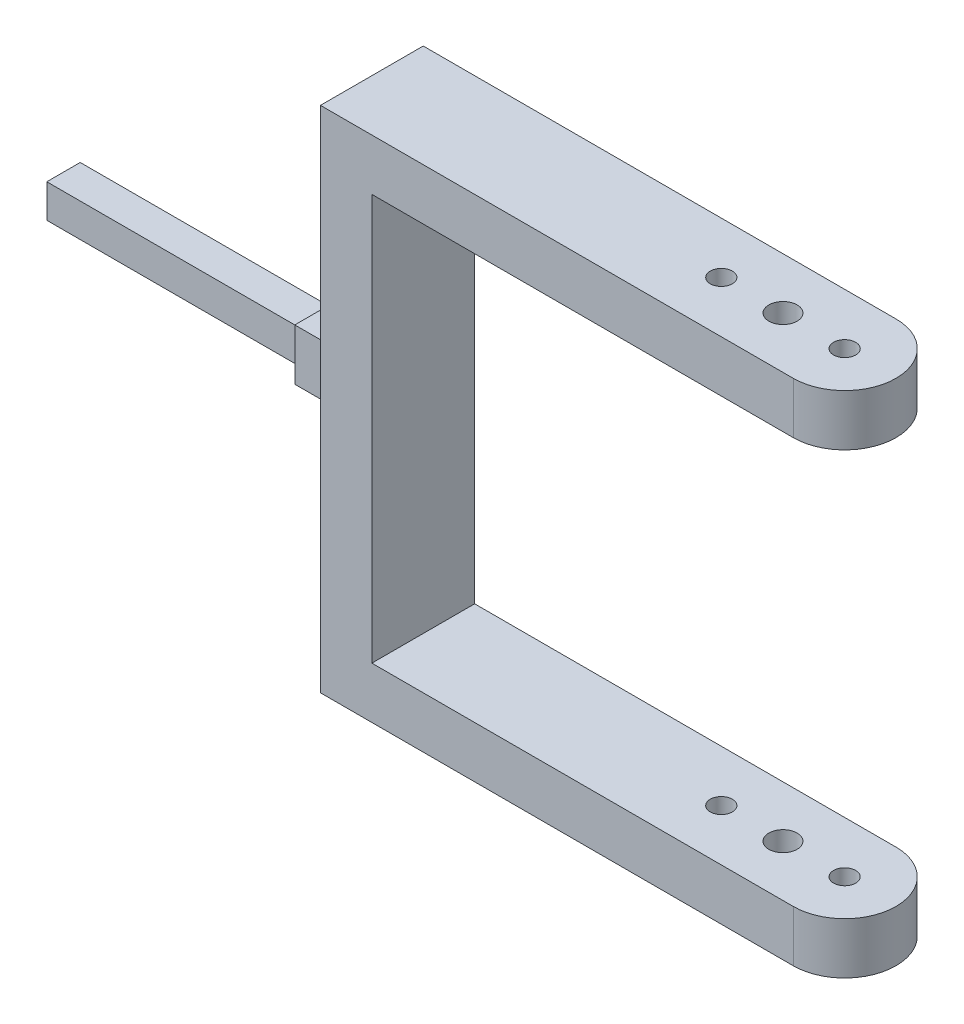
ISO-10303-21;
HEADER;
FILE_DESCRIPTION(('STEP AP214'),'2;1');
FILE_NAME('part.step','',(''),(''),'','','');
FILE_SCHEMA(('AUTOMOTIVE_DESIGN { 1 0 10303 214 1 1 1 1 }'));
ENDSEC;
DATA;
#1=APPLICATION_CONTEXT('core data for automotive mechanical design processes');
#2=APPLICATION_PROTOCOL_DEFINITION('international standard','automotive_design',2000,#1);
#3=PRODUCT_CONTEXT('',#1,'mechanical');
#4=PRODUCT('Part','Part','',(#3));
#5=PRODUCT_RELATED_PRODUCT_CATEGORY('part','',(#4));
#6=PRODUCT_DEFINITION_FORMATION('','',#4);
#7=PRODUCT_DEFINITION_CONTEXT('part definition',#1,'design');
#8=PRODUCT_DEFINITION('design','',#6,#7);
#9=PRODUCT_DEFINITION_SHAPE('','',#8);
#10=(LENGTH_UNIT() NAMED_UNIT(*) SI_UNIT(.MILLI.,.METRE.));
#11=(NAMED_UNIT(*) PLANE_ANGLE_UNIT() SI_UNIT($,.RADIAN.));
#12=(NAMED_UNIT(*) SI_UNIT($,.STERADIAN.) SOLID_ANGLE_UNIT());
#13=UNCERTAINTY_MEASURE_WITH_UNIT(LENGTH_MEASURE(1.E-05),#10,'distance_accuracy_value','');
#14=(GEOMETRIC_REPRESENTATION_CONTEXT(3) GLOBAL_UNCERTAINTY_ASSIGNED_CONTEXT((#13)) GLOBAL_UNIT_ASSIGNED_CONTEXT((#10,
#11,#12)) REPRESENTATION_CONTEXT('',''));
#15=CARTESIAN_POINT('',(0.,0.,0.));
#16=DIRECTION('',(0.,0.,1.));
#17=DIRECTION('',(1.,0.,0.));
#18=AXIS2_PLACEMENT_3D('',#15,#16,#17);
#19=CARTESIAN_POINT('',(80.,49.5,20.));
#20=DIRECTION('',(0.,-1.,0.));
#21=DIRECTION('',(1.,0.,0.));
#22=AXIS2_PLACEMENT_3D('',#19,#20,#21);
#23=PLANE('',#22);
#24=CARTESIAN_POINT('',(82.,49.5,10.));
#25=DIRECTION('',(0.,1.,0.));
#26=DIRECTION('',(-1.,0.,0.));
#27=AXIS2_PLACEMENT_3D('',#24,#25,#26);
#28=CIRCLE('',#27,2.15);
#29=CARTESIAN_POINT('',(79.85,49.5,10.));
#30=VERTEX_POINT('',#29);
#31=EDGE_CURVE('E325',#30,#30,#28,.T.);
#32=ORIENTED_EDGE('',*,*,#31,.F.);
#33=EDGE_LOOP('',(#32));
#34=FACE_BOUND('',#33,.T.);
#35=CARTESIAN_POINT('',(70.,49.5,10.));
#36=DIRECTION('',(0.,1.,0.));
#37=DIRECTION('',(-1.,0.,0.));
#38=AXIS2_PLACEMENT_3D('',#35,#36,#37);
#39=CIRCLE('',#38,2.74999999999999);
#40=CARTESIAN_POINT('',(67.25,49.5,10.));
#41=VERTEX_POINT('',#40);
#42=EDGE_CURVE('E336',#41,#41,#39,.T.);
#43=ORIENTED_EDGE('',*,*,#42,.F.);
#44=EDGE_LOOP('',(#43));
#45=FACE_BOUND('',#44,.T.);
#46=CARTESIAN_POINT('',(58.,49.5,10.));
#47=DIRECTION('',(0.,1.,0.));
#48=DIRECTION('',(-1.,0.,0.));
#49=AXIS2_PLACEMENT_3D('',#46,#47,#48);
#50=CIRCLE('',#49,2.15);
#51=CARTESIAN_POINT('',(55.85,49.5,10.));
#52=VERTEX_POINT('',#51);
#53=EDGE_CURVE('E335',#52,#52,#50,.T.);
#54=ORIENTED_EDGE('',*,*,#53,.F.);
#55=EDGE_LOOP('',(#54));
#56=FACE_BOUND('',#55,.T.);
#57=DIRECTION('',(-1.,0.,0.));
#58=VECTOR('',#57,1.);
#59=CARTESIAN_POINT('',(80.,49.5,20.));
#60=LINE('',#59,#58);
#61=CARTESIAN_POINT('',(82.,49.5,20.));
#62=VERTEX_POINT('',#61);
#63=CARTESIAN_POINT('',(-9.99999999999999,49.5,20.));
#64=VERTEX_POINT('',#63);
#65=EDGE_CURVE('E201',#62,#64,#60,.T.);
#66=ORIENTED_EDGE('',*,*,#65,.F.);
#67=CARTESIAN_POINT('',(82.,49.5,10.));
#68=DIRECTION('',(0.,1.,0.));
#69=DIRECTION('',(-1.,0.,0.));
#70=AXIS2_PLACEMENT_3D('',#67,#68,#69);
#71=CIRCLE('',#70,10.);
#72=CARTESIAN_POINT('',(82.,49.5,0.));
#73=VERTEX_POINT('',#72);
#74=EDGE_CURVE('E183',#62,#73,#71,.T.);
#75=ORIENTED_EDGE('',*,*,#74,.T.);
#76=DIRECTION('',(-1.,0.,0.));
#77=VECTOR('',#76,1.);
#78=CARTESIAN_POINT('',(80.,49.5,0.));
#79=LINE('',#78,#77);
#80=CARTESIAN_POINT('',(-9.99999999999999,49.5,0.));
#81=VERTEX_POINT('',#80);
#82=EDGE_CURVE('E210',#73,#81,#79,.T.);
#83=ORIENTED_EDGE('',*,*,#82,.T.);
#84=DIRECTION('',(0.,0.,-1.));
#85=VECTOR('',#84,1.);
#86=CARTESIAN_POINT('',(-9.99999999999999,49.5,20.));
#87=LINE('',#86,#85);
#88=EDGE_CURVE('E68',#64,#81,#87,.T.);
#89=ORIENTED_EDGE('',*,*,#88,.F.);
#90=EDGE_LOOP('',(#66,#75,#83,#89));
#91=FACE_BOUND('',#90,.T.);
#92=ADVANCED_FACE('F61',(#34,#45,#56,#91),#23,.F.);
#93=CARTESIAN_POINT('',(-9.99999999999999,-49.5,20.));
#94=DIRECTION('',(0.,1.,0.));
#95=DIRECTION('',(-1.,0.,0.));
#96=AXIS2_PLACEMENT_3D('',#93,#94,#95);
#97=PLANE('',#96);
#98=CARTESIAN_POINT('',(82.,-49.5,10.));
#99=DIRECTION('',(0.,1.,0.));
#100=DIRECTION('',(-1.,0.,0.));
#101=AXIS2_PLACEMENT_3D('',#98,#99,#100);
#102=CIRCLE('',#101,2.15);
#103=CARTESIAN_POINT('',(79.85,-49.5,10.));
#104=VERTEX_POINT('',#103);
#105=EDGE_CURVE('E328',#104,#104,#102,.T.);
#106=ORIENTED_EDGE('',*,*,#105,.T.);
#107=EDGE_LOOP('',(#106));
#108=FACE_BOUND('',#107,.T.);
#109=CARTESIAN_POINT('',(70.,-49.5,10.));
#110=DIRECTION('',(0.,1.,0.));
#111=DIRECTION('',(-1.,0.,0.));
#112=AXIS2_PLACEMENT_3D('',#109,#110,#111);
#113=CIRCLE('',#112,2.74999999999999);
#114=CARTESIAN_POINT('',(67.25,-49.5,10.));
#115=VERTEX_POINT('',#114);
#116=EDGE_CURVE('E332',#115,#115,#113,.T.);
#117=ORIENTED_EDGE('',*,*,#116,.T.);
#118=EDGE_LOOP('',(#117));
#119=FACE_BOUND('',#118,.T.);
#120=CARTESIAN_POINT('',(58.,-49.5,10.));
#121=DIRECTION('',(0.,1.,0.));
#122=DIRECTION('',(-1.,0.,0.));
#123=AXIS2_PLACEMENT_3D('',#120,#121,#122);
#124=CIRCLE('',#123,2.15);
#125=CARTESIAN_POINT('',(55.85,-49.5,10.));
#126=VERTEX_POINT('',#125);
#127=EDGE_CURVE('E342',#126,#126,#124,.T.);
#128=ORIENTED_EDGE('',*,*,#127,.T.);
#129=EDGE_LOOP('',(#128));
#130=FACE_BOUND('',#129,.T.);
#131=CARTESIAN_POINT('',(82.,-49.5,10.));
#132=DIRECTION('',(0.,1.,0.));
#133=DIRECTION('',(-1.,0.,0.));
#134=AXIS2_PLACEMENT_3D('',#131,#132,#133);
#135=CIRCLE('',#134,10.);
#136=CARTESIAN_POINT('',(82.,-49.5,20.));
#137=VERTEX_POINT('',#136);
#138=CARTESIAN_POINT('',(82.,-49.5,0.));
#139=VERTEX_POINT('',#138);
#140=EDGE_CURVE('E172',#137,#139,#135,.T.);
#141=ORIENTED_EDGE('',*,*,#140,.F.);
#142=DIRECTION('',(1.,0.,0.));
#143=VECTOR('',#142,1.);
#144=CARTESIAN_POINT('',(-9.99999999999999,-49.5,20.));
#145=LINE('',#144,#143);
#146=CARTESIAN_POINT('',(-9.99999999999999,-49.5,20.));
#147=VERTEX_POINT('',#146);
#148=EDGE_CURVE('E177',#147,#137,#145,.T.);
#149=ORIENTED_EDGE('',*,*,#148,.F.);
#150=DIRECTION('',(0.,0.,-1.));
#151=VECTOR('',#150,1.);
#152=CARTESIAN_POINT('',(-9.99999999999999,-49.5,20.));
#153=LINE('',#152,#151);
#154=CARTESIAN_POINT('',(-9.99999999999999,-49.5,0.));
#155=VERTEX_POINT('',#154);
#156=EDGE_CURVE('E228',#147,#155,#153,.T.);
#157=ORIENTED_EDGE('',*,*,#156,.T.);
#158=DIRECTION('',(1.,0.,0.));
#159=VECTOR('',#158,1.);
#160=CARTESIAN_POINT('',(-9.99999999999999,-49.5,0.));
#161=LINE('',#160,#159);
#162=EDGE_CURVE('E179',#155,#139,#161,.T.);
#163=ORIENTED_EDGE('',*,*,#162,.T.);
#164=EDGE_LOOP('',(#141,#149,#157,#163));
#165=FACE_BOUND('',#164,.T.);
#166=ADVANCED_FACE('F174',(#108,#119,#130,#165),#97,.F.);
#167=CARTESIAN_POINT('',(80.,-39.4999999999999,20.));
#168=DIRECTION('',(0.,-1.,0.));
#169=DIRECTION('',(1.,0.,0.));
#170=AXIS2_PLACEMENT_3D('',#167,#168,#169);
#171=PLANE('',#170);
#172=CARTESIAN_POINT('',(82.,-39.4999999999999,10.));
#173=DIRECTION('',(0.,-1.,0.));
#174=DIRECTION('',(1.,0.,0.));
#175=AXIS2_PLACEMENT_3D('',#172,#173,#174);
#176=CIRCLE('',#175,2.15);
#177=CARTESIAN_POINT('',(84.15,-39.4999999999999,10.));
#178=VERTEX_POINT('',#177);
#179=EDGE_CURVE('E238',#178,#178,#176,.T.);
#180=ORIENTED_EDGE('',*,*,#179,.T.);
#181=EDGE_LOOP('',(#180));
#182=FACE_BOUND('',#181,.T.);
#183=CARTESIAN_POINT('',(70.,-39.5,10.));
#184=DIRECTION('',(0.,-1.,0.));
#185=DIRECTION('',(1.,0.,0.));
#186=AXIS2_PLACEMENT_3D('',#183,#184,#185);
#187=CIRCLE('',#186,2.74999999999999);
#188=CARTESIAN_POINT('',(72.75,-39.5,10.));
#189=VERTEX_POINT('',#188);
#190=EDGE_CURVE('E235',#189,#189,#187,.T.);
#191=ORIENTED_EDGE('',*,*,#190,.T.);
#192=EDGE_LOOP('',(#191));
#193=FACE_BOUND('',#192,.T.);
#194=CARTESIAN_POINT('',(58.,-39.5,10.));
#195=DIRECTION('',(0.,-1.,0.));
#196=DIRECTION('',(1.,0.,0.));
#197=AXIS2_PLACEMENT_3D('',#194,#195,#196);
#198=CIRCLE('',#197,2.15);
#199=CARTESIAN_POINT('',(60.15,-39.5,10.));
#200=VERTEX_POINT('',#199);
#201=EDGE_CURVE('E241',#200,#200,#198,.T.);
#202=ORIENTED_EDGE('',*,*,#201,.T.);
#203=EDGE_LOOP('',(#202));
#204=FACE_BOUND('',#203,.T.);
#205=DIRECTION('',(-1.,0.,0.));
#206=VECTOR('',#205,1.);
#207=CARTESIAN_POINT('',(80.,-39.4999999999999,20.));
#208=LINE('',#207,#206);
#209=CARTESIAN_POINT('',(82.,-39.5,20.));
#210=VERTEX_POINT('',#209);
#211=CARTESIAN_POINT('',(0.,-39.5,20.));
#212=VERTEX_POINT('',#211);
#213=EDGE_CURVE('E197',#210,#212,#208,.T.);
#214=ORIENTED_EDGE('',*,*,#213,.F.);
#215=CARTESIAN_POINT('',(82.,-39.4999999999999,10.));
#216=DIRECTION('',(0.,-1.,0.));
#217=DIRECTION('',(1.,0.,0.));
#218=AXIS2_PLACEMENT_3D('',#215,#216,#217);
#219=CIRCLE('',#218,10.);
#220=CARTESIAN_POINT('',(82.,-39.5,0.));
#221=VERTEX_POINT('',#220);
#222=EDGE_CURVE('E189',#221,#210,#219,.T.);
#223=ORIENTED_EDGE('',*,*,#222,.F.);
#224=DIRECTION('',(-1.,0.,0.));
#225=VECTOR('',#224,1.);
#226=CARTESIAN_POINT('',(80.,-39.4999999999999,0.));
#227=LINE('',#226,#225);
#228=CARTESIAN_POINT('',(0.,-39.5,0.));
#229=VERTEX_POINT('',#228);
#230=EDGE_CURVE('E216',#221,#229,#227,.T.);
#231=ORIENTED_EDGE('',*,*,#230,.T.);
#232=DIRECTION('',(0.,0.,-1.));
#233=VECTOR('',#232,1.);
#234=CARTESIAN_POINT('',(0.,-39.5,20.));
#235=LINE('',#234,#233);
#236=EDGE_CURVE('E225',#212,#229,#235,.T.);
#237=ORIENTED_EDGE('',*,*,#236,.F.);
#238=EDGE_LOOP('',(#214,#223,#231,#237));
#239=FACE_BOUND('',#238,.T.);
#240=ADVANCED_FACE('F361',(#182,#193,#204,#239),#171,.F.);
#241=CARTESIAN_POINT('',(0.,39.5,20.));
#242=DIRECTION('',(0.,1.,0.));
#243=DIRECTION('',(0.,0.,1.));
#244=AXIS2_PLACEMENT_3D('',#241,#242,#243);
#245=PLANE('',#244);
#246=CARTESIAN_POINT('',(82.,39.5,10.));
#247=DIRECTION('',(0.,1.,0.));
#248=DIRECTION('',(0.,0.,1.));
#249=AXIS2_PLACEMENT_3D('',#246,#247,#248);
#250=CIRCLE('',#249,2.15);
#251=CARTESIAN_POINT('',(82.,39.5,12.15));
#252=VERTEX_POINT('',#251);
#253=EDGE_CURVE('E236',#252,#252,#250,.T.);
#254=ORIENTED_EDGE('',*,*,#253,.T.);
#255=EDGE_LOOP('',(#254));
#256=FACE_BOUND('',#255,.T.);
#257=CARTESIAN_POINT('',(70.,39.5,10.));
#258=DIRECTION('',(0.,1.,0.));
#259=DIRECTION('',(0.,0.,1.));
#260=AXIS2_PLACEMENT_3D('',#257,#258,#259);
#261=CIRCLE('',#260,2.74999999999999);
#262=CARTESIAN_POINT('',(70.,39.5,12.75));
#263=VERTEX_POINT('',#262);
#264=EDGE_CURVE('E232',#263,#263,#261,.T.);
#265=ORIENTED_EDGE('',*,*,#264,.T.);
#266=EDGE_LOOP('',(#265));
#267=FACE_BOUND('',#266,.T.);
#268=CARTESIAN_POINT('',(58.,39.5,10.));
#269=DIRECTION('',(0.,1.,0.));
#270=DIRECTION('',(0.,0.,1.));
#271=AXIS2_PLACEMENT_3D('',#268,#269,#270);
#272=CIRCLE('',#271,2.15);
#273=CARTESIAN_POINT('',(58.,39.5,12.15));
#274=VERTEX_POINT('',#273);
#275=EDGE_CURVE('E239',#274,#274,#272,.T.);
#276=ORIENTED_EDGE('',*,*,#275,.T.);
#277=EDGE_LOOP('',(#276));
#278=FACE_BOUND('',#277,.T.);
#279=CARTESIAN_POINT('',(82.,39.5,10.));
#280=DIRECTION('',(0.,1.,0.));
#281=DIRECTION('',(0.,0.,1.));
#282=AXIS2_PLACEMENT_3D('',#279,#280,#281);
#283=CIRCLE('',#282,10.);
#284=CARTESIAN_POINT('',(82.,39.5,20.));
#285=VERTEX_POINT('',#284);
#286=CARTESIAN_POINT('',(82.,39.5,0.));
#287=VERTEX_POINT('',#286);
#288=EDGE_CURVE('E341',#285,#287,#283,.T.);
#289=ORIENTED_EDGE('',*,*,#288,.F.);
#290=DIRECTION('',(1.,0.,0.));
#291=VECTOR('',#290,1.);
#292=CARTESIAN_POINT('',(0.,39.5,20.));
#293=LINE('',#292,#291);
#294=CARTESIAN_POINT('',(0.,39.5,20.));
#295=VERTEX_POINT('',#294);
#296=EDGE_CURVE('E206',#295,#285,#293,.T.);
#297=ORIENTED_EDGE('',*,*,#296,.F.);
#298=DIRECTION('',(0.,0.,-1.));
#299=VECTOR('',#298,1.);
#300=CARTESIAN_POINT('',(0.,39.5,20.));
#301=LINE('',#300,#299);
#302=CARTESIAN_POINT('',(0.,39.5,0.));
#303=VERTEX_POINT('',#302);
#304=EDGE_CURVE('E209',#295,#303,#301,.T.);
#305=ORIENTED_EDGE('',*,*,#304,.T.);
#306=DIRECTION('',(1.,0.,0.));
#307=VECTOR('',#306,1.);
#308=CARTESIAN_POINT('',(0.,39.5,0.));
#309=LINE('',#308,#307);
#310=EDGE_CURVE('E220',#303,#287,#309,.T.);
#311=ORIENTED_EDGE('',*,*,#310,.T.);
#312=EDGE_LOOP('',(#289,#297,#305,#311));
#313=FACE_BOUND('',#312,.T.);
#314=ADVANCED_FACE('F376',(#256,#267,#278,#313),#245,.F.);
#315=CARTESIAN_POINT('',(0.,0.,20.));
#316=DIRECTION('',(0.,0.,1.));
#317=DIRECTION('',(1.,0.,0.));
#318=AXIS2_PLACEMENT_3D('',#315,#316,#317);
#319=PLANE('',#318);
#320=ORIENTED_EDGE('',*,*,#148,.T.);
#321=DIRECTION('',(0.,1.,0.));
#322=VECTOR('',#321,1.);
#323=CARTESIAN_POINT('',(82.,-49.5,20.));
#324=LINE('',#323,#322);
#325=EDGE_CURVE('E186',#137,#210,#324,.T.);
#326=ORIENTED_EDGE('',*,*,#325,.T.);
#327=ORIENTED_EDGE('',*,*,#213,.T.);
#328=DIRECTION('',(0.,1.,0.));
#329=VECTOR('',#328,1.);
#330=CARTESIAN_POINT('',(0.,39.5,20.));
#331=LINE('',#330,#329);
#332=EDGE_CURVE('E199',#212,#295,#331,.T.);
#333=ORIENTED_EDGE('',*,*,#332,.T.);
#334=ORIENTED_EDGE('',*,*,#296,.T.);
#335=DIRECTION('',(0.,1.,0.));
#336=VECTOR('',#335,1.);
#337=CARTESIAN_POINT('',(82.,-49.5,20.));
#338=LINE('',#337,#336);
#339=EDGE_CURVE('E12',#285,#62,#338,.T.);
#340=ORIENTED_EDGE('',*,*,#339,.T.);
#341=ORIENTED_EDGE('',*,*,#65,.T.);
#342=DIRECTION('',(0.,-1.,0.));
#343=VECTOR('',#342,1.);
#344=CARTESIAN_POINT('',(-9.99999999999999,49.5,20.));
#345=LINE('',#344,#343);
#346=EDGE_CURVE('E195',#64,#147,#345,.T.);
#347=ORIENTED_EDGE('',*,*,#346,.T.);
#348=EDGE_LOOP('',(#320,#326,#327,#333,#334,#340,#341,#347));
#349=FACE_BOUND('',#348,.T.);
#350=ADVANCED_FACE('F193',(#349),#319,.T.);
#351=CARTESIAN_POINT('',(0.,0.,0.));
#352=DIRECTION('',(0.,0.,1.));
#353=DIRECTION('',(1.,0.,0.));
#354=AXIS2_PLACEMENT_3D('',#351,#352,#353);
#355=PLANE('',#354);
#356=DIRECTION('',(0.,1.,0.));
#357=VECTOR('',#356,1.);
#358=CARTESIAN_POINT('',(82.,-49.5,0.));
#359=LINE('',#358,#357);
#360=EDGE_CURVE('E323',#139,#221,#359,.T.);
#361=ORIENTED_EDGE('',*,*,#360,.F.);
#362=ORIENTED_EDGE('',*,*,#162,.F.);
#363=DIRECTION('',(0.,-1.,0.));
#364=VECTOR('',#363,1.);
#365=CARTESIAN_POINT('',(-9.99999999999999,49.5,0.));
#366=LINE('',#365,#364);
#367=EDGE_CURVE('E212',#81,#155,#366,.T.);
#368=ORIENTED_EDGE('',*,*,#367,.F.);
#369=ORIENTED_EDGE('',*,*,#82,.F.);
#370=EDGE_CURVE('E182',#287,#73,#359,.T.);
#371=ORIENTED_EDGE('',*,*,#370,.F.);
#372=ORIENTED_EDGE('',*,*,#310,.F.);
#373=DIRECTION('',(0.,1.,0.));
#374=VECTOR('',#373,1.);
#375=CARTESIAN_POINT('',(0.,39.5,0.));
#376=LINE('',#375,#374);
#377=EDGE_CURVE('E218',#229,#303,#376,.T.);
#378=ORIENTED_EDGE('',*,*,#377,.F.);
#379=ORIENTED_EDGE('',*,*,#230,.F.);
#380=EDGE_LOOP('',(#361,#362,#368,#369,#371,#372,#378,#379));
#381=FACE_BOUND('',#380,.T.);
#382=ADVANCED_FACE('F321',(#381),#355,.F.);
#383=CARTESIAN_POINT('',(-20.,0.,0.));
#384=DIRECTION('',(-1.,0.,0.));
#385=DIRECTION('',(0.,-1.,0.));
#386=AXIS2_PLACEMENT_3D('',#383,#384,#385);
#387=PLANE('',#386);
#388=DIRECTION('',(0.,-1.,0.));
#389=VECTOR('',#388,1.);
#390=CARTESIAN_POINT('',(-20.,0.,15.));
#391=LINE('',#390,#389);
#392=CARTESIAN_POINT('',(-20.,5.00000000000001,15.));
#393=VERTEX_POINT('',#392);
#394=CARTESIAN_POINT('',(-20.,-4.99999999999999,15.));
#395=VERTEX_POINT('',#394);
#396=EDGE_CURVE('E282',#393,#395,#391,.T.);
#397=ORIENTED_EDGE('',*,*,#396,.F.);
#398=DIRECTION('',(0.,0.,1.));
#399=VECTOR('',#398,1.);
#400=CARTESIAN_POINT('',(-20.,5.,0.));
#401=LINE('',#400,#399);
#402=CARTESIAN_POINT('',(-20.,5.00000000000001,5.));
#403=VERTEX_POINT('',#402);
#404=EDGE_CURVE('E285',#403,#393,#401,.T.);
#405=ORIENTED_EDGE('',*,*,#404,.F.);
#406=DIRECTION('',(0.,-1.,0.));
#407=VECTOR('',#406,1.);
#408=CARTESIAN_POINT('',(-20.,0.,5.));
#409=LINE('',#408,#407);
#410=CARTESIAN_POINT('',(-20.,-4.99999999999999,5.));
#411=VERTEX_POINT('',#410);
#412=EDGE_CURVE('E289',#403,#411,#409,.T.);
#413=ORIENTED_EDGE('',*,*,#412,.T.);
#414=DIRECTION('',(0.,0.,1.));
#415=VECTOR('',#414,1.);
#416=CARTESIAN_POINT('',(-20.,-4.99999999999999,0.));
#417=LINE('',#416,#415);
#418=EDGE_CURVE('E291',#411,#395,#417,.T.);
#419=ORIENTED_EDGE('',*,*,#418,.T.);
#420=EDGE_LOOP('',(#397,#405,#413,#419));
#421=FACE_BOUND('',#420,.T.);
#422=DIRECTION('',(0.,1.,0.));
#423=VECTOR('',#422,1.);
#424=CARTESIAN_POINT('',(-20.,0.,13.25));
#425=LINE('',#424,#423);
#426=CARTESIAN_POINT('',(-20.,-3.24999999999999,13.25));
#427=VERTEX_POINT('',#426);
#428=CARTESIAN_POINT('',(-20.,3.25000000000001,13.25));
#429=VERTEX_POINT('',#428);
#430=EDGE_CURVE('E257',#427,#429,#425,.T.);
#431=ORIENTED_EDGE('',*,*,#430,.F.);
#432=DIRECTION('',(0.,0.,-1.));
#433=VECTOR('',#432,1.);
#434=CARTESIAN_POINT('',(-20.,-3.24999999999999,0.));
#435=LINE('',#434,#433);
#436=CARTESIAN_POINT('',(-20.,-3.24999999999999,6.75));
#437=VERTEX_POINT('',#436);
#438=EDGE_CURVE('E75',#427,#437,#435,.T.);
#439=ORIENTED_EDGE('',*,*,#438,.T.);
#440=DIRECTION('',(0.,1.,0.));
#441=VECTOR('',#440,1.);
#442=CARTESIAN_POINT('',(-20.,0.,6.75));
#443=LINE('',#442,#441);
#444=CARTESIAN_POINT('',(-20.,3.25000000000001,6.75));
#445=VERTEX_POINT('',#444);
#446=EDGE_CURVE('E80',#437,#445,#443,.T.);
#447=ORIENTED_EDGE('',*,*,#446,.T.);
#448=DIRECTION('',(0.,0.,-1.));
#449=VECTOR('',#448,1.);
#450=CARTESIAN_POINT('',(-20.,3.25000000000001,0.));
#451=LINE('',#450,#449);
#452=EDGE_CURVE('E267',#429,#445,#451,.T.);
#453=ORIENTED_EDGE('',*,*,#452,.F.);
#454=EDGE_LOOP('',(#431,#439,#447,#453));
#455=FACE_BOUND('',#454,.T.);
#456=ADVANCED_FACE('F397',(#421,#455),#387,.T.);
#457=CARTESIAN_POINT('',(-9.99999999999999,49.5,20.));
#458=DIRECTION('',(1.,0.,0.));
#459=DIRECTION('',(0.,1.,0.));
#460=AXIS2_PLACEMENT_3D('',#457,#458,#459);
#461=PLANE('',#460);
#462=DIRECTION('',(0.,0.,1.));
#463=VECTOR('',#462,1.);
#464=CARTESIAN_POINT('',(-9.99999999999999,5.00000000000001,0.));
#465=LINE('',#464,#463);
#466=CARTESIAN_POINT('',(-9.99999999999999,5.,5.));
#467=VERTEX_POINT('',#466);
#468=CARTESIAN_POINT('',(-9.99999999999999,5.,15.));
#469=VERTEX_POINT('',#468);
#470=EDGE_CURVE('E295',#467,#469,#465,.T.);
#471=ORIENTED_EDGE('',*,*,#470,.T.);
#472=DIRECTION('',(0.,-1.,0.));
#473=VECTOR('',#472,1.);
#474=CARTESIAN_POINT('',(-9.99999999999999,0.,15.));
#475=LINE('',#474,#473);
#476=CARTESIAN_POINT('',(-9.99999999999999,-4.99999999999999,15.));
#477=VERTEX_POINT('',#476);
#478=EDGE_CURVE('E275',#469,#477,#475,.T.);
#479=ORIENTED_EDGE('',*,*,#478,.T.);
#480=DIRECTION('',(0.,0.,1.));
#481=VECTOR('',#480,1.);
#482=CARTESIAN_POINT('',(-9.99999999999999,-4.99999999999999,0.));
#483=LINE('',#482,#481);
#484=CARTESIAN_POINT('',(-9.99999999999999,-5.,5.));
#485=VERTEX_POINT('',#484);
#486=EDGE_CURVE('E286',#485,#477,#483,.T.);
#487=ORIENTED_EDGE('',*,*,#486,.F.);
#488=DIRECTION('',(0.,-1.,0.));
#489=VECTOR('',#488,1.);
#490=CARTESIAN_POINT('',(-9.99999999999999,0.,5.));
#491=LINE('',#490,#489);
#492=EDGE_CURVE('E297',#467,#485,#491,.T.);
#493=ORIENTED_EDGE('',*,*,#492,.F.);
#494=EDGE_LOOP('',(#471,#479,#487,#493));
#495=FACE_BOUND('',#494,.T.);
#496=ORIENTED_EDGE('',*,*,#367,.T.);
#497=ORIENTED_EDGE('',*,*,#156,.F.);
#498=ORIENTED_EDGE('',*,*,#346,.F.);
#499=ORIENTED_EDGE('',*,*,#88,.T.);
#500=EDGE_LOOP('',(#496,#497,#498,#499));
#501=FACE_BOUND('',#500,.T.);
#502=ADVANCED_FACE('F319',(#495,#501),#461,.F.);
#503=CARTESIAN_POINT('',(0.,39.5,20.));
#504=DIRECTION('',(-1.,0.,0.));
#505=DIRECTION('',(0.,0.,1.));
#506=AXIS2_PLACEMENT_3D('',#503,#504,#505);
#507=PLANE('',#506);
#508=ORIENTED_EDGE('',*,*,#377,.T.);
#509=ORIENTED_EDGE('',*,*,#304,.F.);
#510=ORIENTED_EDGE('',*,*,#332,.F.);
#511=ORIENTED_EDGE('',*,*,#236,.T.);
#512=EDGE_LOOP('',(#508,#509,#510,#511));
#513=FACE_BOUND('',#512,.T.);
#514=ADVANCED_FACE('F388',(#513),#507,.F.);
#515=CARTESIAN_POINT('',(-20.,0.,15.));
#516=DIRECTION('',(0.,0.,1.));
#517=DIRECTION('',(1.,0.,0.));
#518=AXIS2_PLACEMENT_3D('',#515,#516,#517);
#519=PLANE('',#518);
#520=ORIENTED_EDGE('',*,*,#478,.F.);
#521=DIRECTION('',(1.,0.,0.));
#522=VECTOR('',#521,1.);
#523=CARTESIAN_POINT('',(-20.,5.00000000000001,15.));
#524=LINE('',#523,#522);
#525=EDGE_CURVE('E213',#393,#469,#524,.T.);
#526=ORIENTED_EDGE('',*,*,#525,.F.);
#527=ORIENTED_EDGE('',*,*,#396,.T.);
#528=DIRECTION('',(1.,0.,0.));
#529=VECTOR('',#528,1.);
#530=CARTESIAN_POINT('',(-20.,-4.99999999999999,15.));
#531=LINE('',#530,#529);
#532=EDGE_CURVE('E293',#395,#477,#531,.T.);
#533=ORIENTED_EDGE('',*,*,#532,.T.);
#534=EDGE_LOOP('',(#520,#526,#527,#533));
#535=FACE_BOUND('',#534,.T.);
#536=ADVANCED_FACE('F403',(#535),#519,.T.);
#537=CARTESIAN_POINT('',(-20.,5.,0.));
#538=DIRECTION('',(0.,1.,0.));
#539=DIRECTION('',(0.,0.,1.));
#540=AXIS2_PLACEMENT_3D('',#537,#538,#539);
#541=PLANE('',#540);
#542=ORIENTED_EDGE('',*,*,#470,.F.);
#543=DIRECTION('',(1.,0.,0.));
#544=VECTOR('',#543,1.);
#545=CARTESIAN_POINT('',(-20.,5.00000000000001,5.));
#546=LINE('',#545,#544);
#547=EDGE_CURVE('E307',#403,#467,#546,.T.);
#548=ORIENTED_EDGE('',*,*,#547,.F.);
#549=ORIENTED_EDGE('',*,*,#404,.T.);
#550=ORIENTED_EDGE('',*,*,#525,.T.);
#551=EDGE_LOOP('',(#542,#548,#549,#550));
#552=FACE_BOUND('',#551,.T.);
#553=ADVANCED_FACE('F409',(#552),#541,.T.);
#554=CARTESIAN_POINT('',(-20.,0.,5.));
#555=DIRECTION('',(0.,0.,1.));
#556=DIRECTION('',(0.,-1.,0.));
#557=AXIS2_PLACEMENT_3D('',#554,#555,#556);
#558=PLANE('',#557);
#559=ORIENTED_EDGE('',*,*,#492,.T.);
#560=DIRECTION('',(1.,0.,0.));
#561=VECTOR('',#560,1.);
#562=CARTESIAN_POINT('',(-20.,-4.99999999999999,5.));
#563=LINE('',#562,#561);
#564=EDGE_CURVE('E304',#411,#485,#563,.T.);
#565=ORIENTED_EDGE('',*,*,#564,.F.);
#566=ORIENTED_EDGE('',*,*,#412,.F.);
#567=ORIENTED_EDGE('',*,*,#547,.T.);
#568=EDGE_LOOP('',(#559,#565,#566,#567));
#569=FACE_BOUND('',#568,.T.);
#570=ADVANCED_FACE('F419',(#569),#558,.F.);
#571=CARTESIAN_POINT('',(-20.,-4.99999999999999,0.));
#572=DIRECTION('',(0.,1.,0.));
#573=DIRECTION('',(-1.,0.,0.));
#574=AXIS2_PLACEMENT_3D('',#571,#572,#573);
#575=PLANE('',#574);
#576=ORIENTED_EDGE('',*,*,#486,.T.);
#577=ORIENTED_EDGE('',*,*,#532,.F.);
#578=ORIENTED_EDGE('',*,*,#418,.F.);
#579=ORIENTED_EDGE('',*,*,#564,.T.);
#580=EDGE_LOOP('',(#576,#577,#578,#579));
#581=FACE_BOUND('',#580,.T.);
#582=ADVANCED_FACE('F416',(#581),#575,.F.);
#583=CARTESIAN_POINT('',(-70.,-3.25,0.));
#584=DIRECTION('',(0.,-1.,0.));
#585=DIRECTION('',(1.,0.,0.));
#586=AXIS2_PLACEMENT_3D('',#583,#584,#585);
#587=PLANE('',#586);
#588=ORIENTED_EDGE('',*,*,#438,.F.);
#589=DIRECTION('',(1.,0.,0.));
#590=VECTOR('',#589,1.);
#591=CARTESIAN_POINT('',(-70.,-3.25,13.25));
#592=LINE('',#591,#590);
#593=CARTESIAN_POINT('',(-70.,-3.25,13.25));
#594=VERTEX_POINT('',#593);
#595=EDGE_CURVE('E272',#594,#427,#592,.T.);
#596=ORIENTED_EDGE('',*,*,#595,.F.);
#597=DIRECTION('',(0.,0.,-1.));
#598=VECTOR('',#597,1.);
#599=CARTESIAN_POINT('',(-70.,-3.25,0.));
#600=LINE('',#599,#598);
#601=CARTESIAN_POINT('',(-70.,-3.25,6.75));
#602=VERTEX_POINT('',#601);
#603=EDGE_CURVE('E253',#594,#602,#600,.T.);
#604=ORIENTED_EDGE('',*,*,#603,.T.);
#605=DIRECTION('',(1.,0.,0.));
#606=VECTOR('',#605,1.);
#607=CARTESIAN_POINT('',(-70.,-3.25,6.75));
#608=LINE('',#607,#606);
#609=EDGE_CURVE('E264',#602,#437,#608,.T.);
#610=ORIENTED_EDGE('',*,*,#609,.T.);
#611=EDGE_LOOP('',(#588,#596,#604,#610));
#612=FACE_BOUND('',#611,.T.);
#613=ADVANCED_FACE('F427',(#612),#587,.T.);
#614=CARTESIAN_POINT('',(-70.,0.,13.25));
#615=DIRECTION('',(0.,0.,-1.));
#616=DIRECTION('',(0.,1.,0.));
#617=AXIS2_PLACEMENT_3D('',#614,#615,#616);
#618=PLANE('',#617);
#619=ORIENTED_EDGE('',*,*,#430,.T.);
#620=DIRECTION('',(1.,0.,0.));
#621=VECTOR('',#620,1.);
#622=CARTESIAN_POINT('',(-70.,3.25,13.25));
#623=LINE('',#622,#621);
#624=CARTESIAN_POINT('',(-70.,3.25,13.25));
#625=VERTEX_POINT('',#624);
#626=EDGE_CURVE('E276',#625,#429,#623,.T.);
#627=ORIENTED_EDGE('',*,*,#626,.F.);
#628=DIRECTION('',(0.,1.,0.));
#629=VECTOR('',#628,1.);
#630=CARTESIAN_POINT('',(-70.,0.,13.25));
#631=LINE('',#630,#629);
#632=EDGE_CURVE('E262',#594,#625,#631,.T.);
#633=ORIENTED_EDGE('',*,*,#632,.F.);
#634=ORIENTED_EDGE('',*,*,#595,.T.);
#635=EDGE_LOOP('',(#619,#627,#633,#634));
#636=FACE_BOUND('',#635,.T.);
#637=ADVANCED_FACE('F424',(#636),#618,.F.);
#638=CARTESIAN_POINT('',(-70.,3.25,0.));
#639=DIRECTION('',(0.,-1.,0.));
#640=DIRECTION('',(1.,0.,0.));
#641=AXIS2_PLACEMENT_3D('',#638,#639,#640);
#642=PLANE('',#641);
#643=ORIENTED_EDGE('',*,*,#452,.T.);
#644=DIRECTION('',(1.,0.,0.));
#645=VECTOR('',#644,1.);
#646=CARTESIAN_POINT('',(-70.,3.25,6.75));
#647=LINE('',#646,#645);
#648=CARTESIAN_POINT('',(-70.,3.25,6.75));
#649=VERTEX_POINT('',#648);
#650=EDGE_CURVE('E279',#649,#445,#647,.T.);
#651=ORIENTED_EDGE('',*,*,#650,.F.);
#652=DIRECTION('',(0.,0.,-1.));
#653=VECTOR('',#652,1.);
#654=CARTESIAN_POINT('',(-70.,3.25,0.));
#655=LINE('',#654,#653);
#656=EDGE_CURVE('E260',#625,#649,#655,.T.);
#657=ORIENTED_EDGE('',*,*,#656,.F.);
#658=ORIENTED_EDGE('',*,*,#626,.T.);
#659=EDGE_LOOP('',(#643,#651,#657,#658));
#660=FACE_BOUND('',#659,.T.);
#661=ADVANCED_FACE('F434',(#660),#642,.F.);
#662=CARTESIAN_POINT('',(-70.,0.,6.75));
#663=DIRECTION('',(0.,0.,-1.));
#664=DIRECTION('',(-1.,0.,0.));
#665=AXIS2_PLACEMENT_3D('',#662,#663,#664);
#666=PLANE('',#665);
#667=ORIENTED_EDGE('',*,*,#446,.F.);
#668=ORIENTED_EDGE('',*,*,#609,.F.);
#669=DIRECTION('',(0.,1.,0.));
#670=VECTOR('',#669,1.);
#671=CARTESIAN_POINT('',(-70.,0.,6.75));
#672=LINE('',#671,#670);
#673=EDGE_CURVE('E256',#602,#649,#672,.T.);
#674=ORIENTED_EDGE('',*,*,#673,.T.);
#675=ORIENTED_EDGE('',*,*,#650,.T.);
#676=EDGE_LOOP('',(#667,#668,#674,#675));
#677=FACE_BOUND('',#676,.T.);
#678=ADVANCED_FACE('F430',(#677),#666,.T.);
#679=CARTESIAN_POINT('',(-70.,0.,0.));
#680=DIRECTION('',(1.,0.,0.));
#681=DIRECTION('',(0.,1.,0.));
#682=AXIS2_PLACEMENT_3D('',#679,#680,#681);
#683=PLANE('',#682);
#684=ORIENTED_EDGE('',*,*,#603,.F.);
#685=ORIENTED_EDGE('',*,*,#632,.T.);
#686=ORIENTED_EDGE('',*,*,#656,.T.);
#687=ORIENTED_EDGE('',*,*,#673,.F.);
#688=EDGE_LOOP('',(#684,#685,#686,#687));
#689=FACE_BOUND('',#688,.T.);
#690=ADVANCED_FACE('F436',(#689),#683,.F.);
#691=CARTESIAN_POINT('',(82.,-49.5,10.));
#692=DIRECTION('',(0.,1.,0.));
#693=DIRECTION('',(-1.,0.,0.));
#694=AXIS2_PLACEMENT_3D('',#691,#692,#693);
#695=CYLINDRICAL_SURFACE('',#694,10.);
#696=ORIENTED_EDGE('',*,*,#288,.T.);
#697=ORIENTED_EDGE('',*,*,#370,.T.);
#698=ORIENTED_EDGE('',*,*,#74,.F.);
#699=ORIENTED_EDGE('',*,*,#339,.F.);
#700=EDGE_LOOP('',(#696,#697,#698,#699));
#701=FACE_BOUND('',#700,.T.);
#702=ADVANCED_FACE('F383',(#701),#695,.T.);
#703=ORIENTED_EDGE('',*,*,#222,.T.);
#704=ORIENTED_EDGE('',*,*,#325,.F.);
#705=ORIENTED_EDGE('',*,*,#140,.T.);
#706=ORIENTED_EDGE('',*,*,#360,.T.);
#707=EDGE_LOOP('',(#703,#704,#705,#706));
#708=FACE_BOUND('',#707,.T.);
#709=ADVANCED_FACE('F187',(#708),#695,.T.);
#710=CARTESIAN_POINT('',(70.,-49.5,10.));
#711=DIRECTION('',(0.,1.,0.));
#712=DIRECTION('',(-1.,0.,0.));
#713=AXIS2_PLACEMENT_3D('',#710,#711,#712);
#714=CYLINDRICAL_SURFACE('',#713,2.74999999999999);
#715=ORIENTED_EDGE('',*,*,#42,.T.);
#716=EDGE_LOOP('',(#715));
#717=FACE_BOUND('',#716,.T.);
#718=ORIENTED_EDGE('',*,*,#264,.F.);
#719=EDGE_LOOP('',(#718));
#720=FACE_BOUND('',#719,.T.);
#721=ADVANCED_FACE('F368',(#717,#720),#714,.F.);
#722=CARTESIAN_POINT('',(82.,-49.5,10.));
#723=DIRECTION('',(0.,1.,0.));
#724=DIRECTION('',(-1.,0.,0.));
#725=AXIS2_PLACEMENT_3D('',#722,#723,#724);
#726=CYLINDRICAL_SURFACE('',#725,2.15);
#727=ORIENTED_EDGE('',*,*,#31,.T.);
#728=EDGE_LOOP('',(#727));
#729=FACE_BOUND('',#728,.T.);
#730=ORIENTED_EDGE('',*,*,#253,.F.);
#731=EDGE_LOOP('',(#730));
#732=FACE_BOUND('',#731,.T.);
#733=ADVANCED_FACE('F371',(#729,#732),#726,.F.);
#734=CARTESIAN_POINT('',(58.,-49.5,10.));
#735=DIRECTION('',(0.,1.,0.));
#736=DIRECTION('',(-1.,0.,0.));
#737=AXIS2_PLACEMENT_3D('',#734,#735,#736);
#738=CYLINDRICAL_SURFACE('',#737,2.15);
#739=ORIENTED_EDGE('',*,*,#53,.T.);
#740=EDGE_LOOP('',(#739));
#741=FACE_BOUND('',#740,.T.);
#742=ORIENTED_EDGE('',*,*,#275,.F.);
#743=EDGE_LOOP('',(#742));
#744=FACE_BOUND('',#743,.T.);
#745=ADVANCED_FACE('F353',(#741,#744),#738,.F.);
#746=ORIENTED_EDGE('',*,*,#116,.F.);
#747=EDGE_LOOP('',(#746));
#748=FACE_BOUND('',#747,.T.);
#749=ORIENTED_EDGE('',*,*,#190,.F.);
#750=EDGE_LOOP('',(#749));
#751=FACE_BOUND('',#750,.T.);
#752=ADVANCED_FACE('F373',(#748,#751),#714,.F.);
#753=ORIENTED_EDGE('',*,*,#105,.F.);
#754=EDGE_LOOP('',(#753));
#755=FACE_BOUND('',#754,.T.);
#756=ORIENTED_EDGE('',*,*,#179,.F.);
#757=EDGE_LOOP('',(#756));
#758=FACE_BOUND('',#757,.T.);
#759=ADVANCED_FACE('F447',(#755,#758),#726,.F.);
#760=ORIENTED_EDGE('',*,*,#127,.F.);
#761=EDGE_LOOP('',(#760));
#762=FACE_BOUND('',#761,.T.);
#763=ORIENTED_EDGE('',*,*,#201,.F.);
#764=EDGE_LOOP('',(#763));
#765=FACE_BOUND('',#764,.T.);
#766=ADVANCED_FACE('F595',(#762,#765),#738,.F.);
#767=CLOSED_SHELL('',(#92,#166,#240,#314,#350,#382,#456,#502,#514,#536,#553,#570,#582,#613,#637,
#661,#678,#690,#702,#709,#721,#733,#745,#752,#759,#766));
#768=MANIFOLD_SOLID_BREP('B2',#767);
#769=ADVANCED_BREP_SHAPE_REPRESENTATION('',(#18,#768),#14);
#770=SHAPE_DEFINITION_REPRESENTATION(#9,#769);
ENDSEC;
END-ISO-10303-21;
